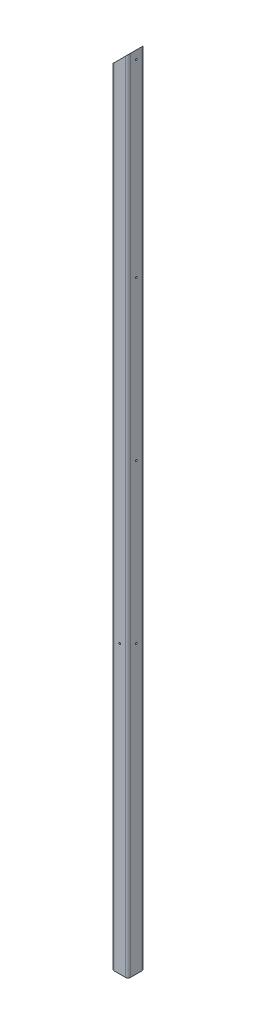
ISO-10303-21;
HEADER;
FILE_DESCRIPTION(('STEP AP214'),'2;1');
FILE_NAME('part.step','',(''),(''),'','','');
FILE_SCHEMA(('AUTOMOTIVE_DESIGN { 1 0 10303 214 1 1 1 1 }'));
ENDSEC;
DATA;
#1=APPLICATION_CONTEXT('core data for automotive mechanical design processes');
#2=APPLICATION_PROTOCOL_DEFINITION('international standard','automotive_design',2000,#1);
#3=PRODUCT_CONTEXT('',#1,'mechanical');
#4=PRODUCT('Part','Part','',(#3));
#5=PRODUCT_RELATED_PRODUCT_CATEGORY('part','',(#4));
#6=PRODUCT_DEFINITION_FORMATION('','',#4);
#7=PRODUCT_DEFINITION_CONTEXT('part definition',#1,'design');
#8=PRODUCT_DEFINITION('design','',#6,#7);
#9=PRODUCT_DEFINITION_SHAPE('','',#8);
#10=(LENGTH_UNIT() NAMED_UNIT(*) SI_UNIT(.MILLI.,.METRE.));
#11=(NAMED_UNIT(*) PLANE_ANGLE_UNIT() SI_UNIT($,.RADIAN.));
#12=(NAMED_UNIT(*) SI_UNIT($,.STERADIAN.) SOLID_ANGLE_UNIT());
#13=UNCERTAINTY_MEASURE_WITH_UNIT(LENGTH_MEASURE(1.E-05),#10,'distance_accuracy_value','');
#14=(GEOMETRIC_REPRESENTATION_CONTEXT(3) GLOBAL_UNCERTAINTY_ASSIGNED_CONTEXT((#13)) GLOBAL_UNIT_ASSIGNED_CONTEXT((#10,
#11,#12)) REPRESENTATION_CONTEXT('',''));
#15=CARTESIAN_POINT('',(0.,0.,0.));
#16=DIRECTION('',(0.,0.,1.));
#17=DIRECTION('',(1.,0.,0.));
#18=AXIS2_PLACEMENT_3D('',#15,#16,#17);
#19=CARTESIAN_POINT('',(-13.6,1920.,13.6));
#20=DIRECTION('',(0.,-1.,0.));
#21=DIRECTION('',(0.,0.,-1.));
#22=AXIS2_PLACEMENT_3D('',#19,#20,#21);
#23=CYLINDRICAL_SURFACE('',#22,6.4);
#24=CARTESIAN_POINT('',(-13.6,1886.4,13.6));
#25=DIRECTION('',(-0.707106781186548,0.707106781186547,0.));
#26=DIRECTION('',(-0.707106781186547,-0.707106781186548,0.));
#27=AXIS2_PLACEMENT_3D('',#24,#25,#26);
#28=ELLIPSE('',#27,9.05096679918782,6.4);
#29=CARTESIAN_POINT('',(-20.,1880.,13.6));
#30=VERTEX_POINT('',#29);
#31=CARTESIAN_POINT('',(-13.5999999999999,1886.4,20.));
#32=VERTEX_POINT('',#31);
#33=EDGE_CURVE('E245',#30,#32,#28,.T.);
#34=ORIENTED_EDGE('',*,*,#33,.F.);
#35=DIRECTION('',(0.,-1.,0.));
#36=VECTOR('',#35,1.);
#37=CARTESIAN_POINT('',(-20.,1920.,13.6));
#38=LINE('',#37,#36);
#39=CARTESIAN_POINT('',(-20.,0.,13.6));
#40=VERTEX_POINT('',#39);
#41=EDGE_CURVE('E161',#30,#40,#38,.T.);
#42=ORIENTED_EDGE('',*,*,#41,.T.);
#43=CARTESIAN_POINT('',(-13.6,0.,13.6));
#44=DIRECTION('',(0.,1.,0.));
#45=DIRECTION('',(0.,0.,1.));
#46=AXIS2_PLACEMENT_3D('',#43,#44,#45);
#47=CIRCLE('',#46,6.4);
#48=CARTESIAN_POINT('',(-13.6,0.,20.));
#49=VERTEX_POINT('',#48);
#50=EDGE_CURVE('E176',#40,#49,#47,.T.);
#51=ORIENTED_EDGE('',*,*,#50,.T.);
#52=DIRECTION('',(0.,-1.,0.));
#53=VECTOR('',#52,1.);
#54=CARTESIAN_POINT('',(-13.6,1920.,20.));
#55=LINE('',#54,#53);
#56=EDGE_CURVE('E12',#32,#49,#55,.T.);
#57=ORIENTED_EDGE('',*,*,#56,.F.);
#58=EDGE_LOOP('',(#34,#42,#51,#57));
#59=FACE_BOUND('',#58,.T.);
#60=ADVANCED_FACE('F66',(#59),#23,.T.);
#61=CARTESIAN_POINT('',(-13.6,1920.,20.));
#62=DIRECTION('',(0.,0.,-1.));
#63=DIRECTION('',(-1.,0.,0.));
#64=AXIS2_PLACEMENT_3D('',#61,#62,#63);
#65=PLANE('',#64);
#66=CARTESIAN_POINT('',(0.,687.,20.));
#67=DIRECTION('',(0.,0.,1.));
#68=DIRECTION('',(1.,0.,0.));
#69=AXIS2_PLACEMENT_3D('',#66,#67,#68);
#70=CIRCLE('',#69,2.);
#71=CARTESIAN_POINT('',(2.,687.,20.));
#72=VERTEX_POINT('',#71);
#73=EDGE_CURVE('E491',#72,#72,#70,.T.);
#74=ORIENTED_EDGE('',*,*,#73,.F.);
#75=EDGE_LOOP('',(#74));
#76=FACE_BOUND('',#75,.T.);
#77=DIRECTION('',(0.707106781186547,0.707106781186548,0.));
#78=VECTOR('',#77,1.);
#79=CARTESIAN_POINT('',(-950.,950.,20.));
#80=LINE('',#79,#78);
#81=CARTESIAN_POINT('',(13.6,1913.6,20.));
#82=VERTEX_POINT('',#81);
#83=EDGE_CURVE('E350',#32,#82,#80,.T.);
#84=ORIENTED_EDGE('',*,*,#83,.F.);
#85=ORIENTED_EDGE('',*,*,#56,.T.);
#86=DIRECTION('',(1.,0.,0.));
#87=VECTOR('',#86,1.);
#88=CARTESIAN_POINT('',(-13.6,0.,20.));
#89=LINE('',#88,#87);
#90=CARTESIAN_POINT('',(13.6,0.,20.));
#91=VERTEX_POINT('',#90);
#92=EDGE_CURVE('E274',#49,#91,#89,.T.);
#93=ORIENTED_EDGE('',*,*,#92,.T.);
#94=DIRECTION('',(0.,-1.,0.));
#95=VECTOR('',#94,1.);
#96=CARTESIAN_POINT('',(13.6,1920.,20.));
#97=LINE('',#96,#95);
#98=EDGE_CURVE('E76',#82,#91,#97,.T.);
#99=ORIENTED_EDGE('',*,*,#98,.F.);
#100=EDGE_LOOP('',(#84,#85,#93,#99));
#101=FACE_BOUND('',#100,.T.);
#102=ADVANCED_FACE('F356',(#76,#101),#65,.F.);
#103=CARTESIAN_POINT('',(13.6,1920.,13.6));
#104=DIRECTION('',(0.,-1.,0.));
#105=DIRECTION('',(0.,0.,-1.));
#106=AXIS2_PLACEMENT_3D('',#103,#104,#105);
#107=CYLINDRICAL_SURFACE('',#106,6.4);
#108=CARTESIAN_POINT('',(13.6,1913.6,13.6));
#109=DIRECTION('',(-0.707106781186548,0.707106781186547,0.));
#110=DIRECTION('',(-0.707106781186547,-0.707106781186548,0.));
#111=AXIS2_PLACEMENT_3D('',#108,#109,#110);
#112=ELLIPSE('',#111,9.05096679918782,6.4);
#113=CARTESIAN_POINT('',(20.,1920.,13.6));
#114=VERTEX_POINT('',#113);
#115=EDGE_CURVE('E93',#82,#114,#112,.T.);
#116=ORIENTED_EDGE('',*,*,#115,.F.);
#117=ORIENTED_EDGE('',*,*,#98,.T.);
#118=CARTESIAN_POINT('',(13.6,0.,13.6));
#119=DIRECTION('',(0.,1.,0.));
#120=DIRECTION('',(0.,0.,1.));
#121=AXIS2_PLACEMENT_3D('',#118,#119,#120);
#122=CIRCLE('',#121,6.4);
#123=CARTESIAN_POINT('',(20.,0.,13.6));
#124=VERTEX_POINT('',#123);
#125=EDGE_CURVE('E278',#91,#124,#122,.T.);
#126=ORIENTED_EDGE('',*,*,#125,.T.);
#127=DIRECTION('',(0.,-1.,0.));
#128=VECTOR('',#127,1.);
#129=CARTESIAN_POINT('',(20.,1920.,13.6));
#130=LINE('',#129,#128);
#131=EDGE_CURVE('E196',#114,#124,#130,.T.);
#132=ORIENTED_EDGE('',*,*,#131,.F.);
#133=EDGE_LOOP('',(#116,#117,#126,#132));
#134=FACE_BOUND('',#133,.T.);
#135=ADVANCED_FACE('F425',(#134),#107,.T.);
#136=CARTESIAN_POINT('',(13.6,1920.,-13.6));
#137=DIRECTION('',(0.,-1.,0.));
#138=DIRECTION('',(0.,0.,-1.));
#139=AXIS2_PLACEMENT_3D('',#136,#137,#138);
#140=CYLINDRICAL_SURFACE('',#139,6.4);
#141=CARTESIAN_POINT('',(13.6,1913.6,-13.6));
#142=DIRECTION('',(-0.707106781186548,0.707106781186547,0.));
#143=DIRECTION('',(-0.707106781186547,-0.707106781186548,0.));
#144=AXIS2_PLACEMENT_3D('',#141,#142,#143);
#145=ELLIPSE('',#144,9.05096679918781,6.4);
#146=CARTESIAN_POINT('',(20.,1920.,-13.6));
#147=VERTEX_POINT('',#146);
#148=CARTESIAN_POINT('',(13.6000000000003,1913.6,-20.));
#149=VERTEX_POINT('',#148);
#150=EDGE_CURVE('E303',#147,#149,#145,.T.);
#151=ORIENTED_EDGE('',*,*,#150,.F.);
#152=DIRECTION('',(0.,-1.,0.));
#153=VECTOR('',#152,1.);
#154=CARTESIAN_POINT('',(20.,1920.,-13.6));
#155=LINE('',#154,#153);
#156=CARTESIAN_POINT('',(20.,0.,-13.6));
#157=VERTEX_POINT('',#156);
#158=EDGE_CURVE('E192',#147,#157,#155,.T.);
#159=ORIENTED_EDGE('',*,*,#158,.T.);
#160=CARTESIAN_POINT('',(13.6,0.,-13.6));
#161=DIRECTION('',(0.,1.,0.));
#162=DIRECTION('',(0.,0.,1.));
#163=AXIS2_PLACEMENT_3D('',#160,#161,#162);
#164=CIRCLE('',#163,6.4);
#165=CARTESIAN_POINT('',(13.6,0.,-20.));
#166=VERTEX_POINT('',#165);
#167=EDGE_CURVE('E284',#157,#166,#164,.T.);
#168=ORIENTED_EDGE('',*,*,#167,.T.);
#169=DIRECTION('',(0.,-1.,0.));
#170=VECTOR('',#169,1.);
#171=CARTESIAN_POINT('',(13.6,1920.,-20.));
#172=LINE('',#171,#170);
#173=EDGE_CURVE('E189',#149,#166,#172,.T.);
#174=ORIENTED_EDGE('',*,*,#173,.F.);
#175=EDGE_LOOP('',(#151,#159,#168,#174));
#176=FACE_BOUND('',#175,.T.);
#177=ADVANCED_FACE('F298',(#176),#140,.T.);
#178=CARTESIAN_POINT('',(13.6,1920.,-20.));
#179=DIRECTION('',(0.,0.,1.));
#180=DIRECTION('',(1.,0.,0.));
#181=AXIS2_PLACEMENT_3D('',#178,#179,#180);
#182=PLANE('',#181);
#183=DIRECTION('',(0.707106781186547,0.707106781186548,0.));
#184=VECTOR('',#183,1.);
#185=CARTESIAN_POINT('',(-950.,950.,-20.));
#186=LINE('',#185,#184);
#187=CARTESIAN_POINT('',(-13.6,1886.4,-20.));
#188=VERTEX_POINT('',#187);
#189=EDGE_CURVE('E358',#188,#149,#186,.T.);
#190=ORIENTED_EDGE('',*,*,#189,.T.);
#191=ORIENTED_EDGE('',*,*,#173,.T.);
#192=DIRECTION('',(-1.,0.,0.));
#193=VECTOR('',#192,1.);
#194=CARTESIAN_POINT('',(13.6,0.,-20.));
#195=LINE('',#194,#193);
#196=CARTESIAN_POINT('',(-13.6,0.,-20.));
#197=VERTEX_POINT('',#196);
#198=EDGE_CURVE('E171',#166,#197,#195,.T.);
#199=ORIENTED_EDGE('',*,*,#198,.T.);
#200=DIRECTION('',(0.,-1.,0.));
#201=VECTOR('',#200,1.);
#202=CARTESIAN_POINT('',(-13.6,1920.,-20.));
#203=LINE('',#202,#201);
#204=EDGE_CURVE('E160',#188,#197,#203,.T.);
#205=ORIENTED_EDGE('',*,*,#204,.F.);
#206=EDGE_LOOP('',(#190,#191,#199,#205));
#207=FACE_BOUND('',#206,.T.);
#208=ADVANCED_FACE('F290',(#207),#182,.F.);
#209=CARTESIAN_POINT('',(-13.6,1920.,-13.6));
#210=DIRECTION('',(0.,-1.,0.));
#211=DIRECTION('',(0.,0.,-1.));
#212=AXIS2_PLACEMENT_3D('',#209,#210,#211);
#213=CYLINDRICAL_SURFACE('',#212,6.4);
#214=CARTESIAN_POINT('',(-13.6,1886.4,-13.6));
#215=DIRECTION('',(-0.707106781186548,0.707106781186547,0.));
#216=DIRECTION('',(-0.707106781186547,-0.707106781186548,0.));
#217=AXIS2_PLACEMENT_3D('',#214,#215,#216);
#218=ELLIPSE('',#217,9.05096679918782,6.4);
#219=CARTESIAN_POINT('',(-20.,1880.,-13.6));
#220=VERTEX_POINT('',#219);
#221=EDGE_CURVE('E331',#188,#220,#218,.T.);
#222=ORIENTED_EDGE('',*,*,#221,.F.);
#223=ORIENTED_EDGE('',*,*,#204,.T.);
#224=CARTESIAN_POINT('',(-13.6,0.,-13.6));
#225=DIRECTION('',(0.,1.,0.));
#226=DIRECTION('',(0.,0.,1.));
#227=AXIS2_PLACEMENT_3D('',#224,#225,#226);
#228=CIRCLE('',#227,6.4);
#229=CARTESIAN_POINT('',(-20.,0.,-13.6));
#230=VERTEX_POINT('',#229);
#231=EDGE_CURVE('E164',#197,#230,#228,.T.);
#232=ORIENTED_EDGE('',*,*,#231,.T.);
#233=DIRECTION('',(0.,-1.,0.));
#234=VECTOR('',#233,1.);
#235=CARTESIAN_POINT('',(-20.,1920.,-13.6));
#236=LINE('',#235,#234);
#237=EDGE_CURVE('E147',#220,#230,#236,.T.);
#238=ORIENTED_EDGE('',*,*,#237,.F.);
#239=EDGE_LOOP('',(#222,#223,#232,#238));
#240=FACE_BOUND('',#239,.T.);
#241=ADVANCED_FACE('F165',(#240),#213,.T.);
#242=CARTESIAN_POINT('',(13.6,1920.,13.6));
#243=DIRECTION('',(0.,-1.,0.));
#244=DIRECTION('',(0.,0.,-1.));
#245=AXIS2_PLACEMENT_3D('',#242,#243,#244);
#246=CYLINDRICAL_SURFACE('',#245,3.2);
#247=DIRECTION('',(0.,-1.,0.));
#248=VECTOR('',#247,1.);
#249=CARTESIAN_POINT('',(13.6,1920.,16.8));
#250=LINE('',#249,#248);
#251=CARTESIAN_POINT('',(13.6,1913.6,16.8));
#252=VERTEX_POINT('',#251);
#253=CARTESIAN_POINT('',(13.6,0.,16.8));
#254=VERTEX_POINT('',#253);
#255=EDGE_CURVE('E70',#252,#254,#250,.T.);
#256=ORIENTED_EDGE('',*,*,#255,.F.);
#257=CARTESIAN_POINT('',(13.6,1913.6,13.6));
#258=DIRECTION('',(-0.707106781186548,0.707106781186547,0.));
#259=DIRECTION('',(-0.707106781186547,-0.707106781186548,0.));
#260=AXIS2_PLACEMENT_3D('',#257,#258,#259);
#261=ELLIPSE('',#260,4.52548339959391,3.2);
#262=CARTESIAN_POINT('',(16.8,1916.8,13.6));
#263=VERTEX_POINT('',#262);
#264=EDGE_CURVE('E327',#252,#263,#261,.T.);
#265=ORIENTED_EDGE('',*,*,#264,.T.);
#266=DIRECTION('',(0.,-1.,0.));
#267=VECTOR('',#266,1.);
#268=CARTESIAN_POINT('',(16.8,1920.,13.6));
#269=LINE('',#268,#267);
#270=CARTESIAN_POINT('',(16.8,0.,13.6));
#271=VERTEX_POINT('',#270);
#272=EDGE_CURVE('E181',#263,#271,#269,.T.);
#273=ORIENTED_EDGE('',*,*,#272,.T.);
#274=CARTESIAN_POINT('',(13.6,0.,13.6));
#275=DIRECTION('',(0.,1.,0.));
#276=DIRECTION('',(0.,0.,1.));
#277=AXIS2_PLACEMENT_3D('',#274,#275,#276);
#278=CIRCLE('',#277,3.2);
#279=EDGE_CURVE('E239',#254,#271,#278,.T.);
#280=ORIENTED_EDGE('',*,*,#279,.F.);
#281=EDGE_LOOP('',(#256,#265,#273,#280));
#282=FACE_BOUND('',#281,.T.);
#283=ADVANCED_FACE('F68',(#282),#246,.F.);
#284=CARTESIAN_POINT('',(-13.6,1920.,16.8));
#285=DIRECTION('',(0.,0.,-1.));
#286=DIRECTION('',(-1.,0.,0.));
#287=AXIS2_PLACEMENT_3D('',#284,#285,#286);
#288=PLANE('',#287);
#289=DIRECTION('',(0.,-1.,0.));
#290=VECTOR('',#289,1.);
#291=CARTESIAN_POINT('',(-13.6,1920.,16.8));
#292=LINE('',#291,#290);
#293=CARTESIAN_POINT('',(-13.6,1886.4,16.8));
#294=VERTEX_POINT('',#293);
#295=CARTESIAN_POINT('',(-13.6,0.,16.8));
#296=VERTEX_POINT('',#295);
#297=EDGE_CURVE('E218',#294,#296,#292,.T.);
#298=ORIENTED_EDGE('',*,*,#297,.F.);
#299=DIRECTION('',(0.707106781186547,0.707106781186548,0.));
#300=VECTOR('',#299,1.);
#301=CARTESIAN_POINT('',(3.19999999999985,1903.2,16.8));
#302=LINE('',#301,#300);
#303=EDGE_CURVE('E235',#294,#252,#302,.T.);
#304=ORIENTED_EDGE('',*,*,#303,.T.);
#305=ORIENTED_EDGE('',*,*,#255,.T.);
#306=DIRECTION('',(1.,0.,0.));
#307=VECTOR('',#306,1.);
#308=CARTESIAN_POINT('',(-13.6,0.,16.8));
#309=LINE('',#308,#307);
#310=EDGE_CURVE('E232',#296,#254,#309,.T.);
#311=ORIENTED_EDGE('',*,*,#310,.F.);
#312=EDGE_LOOP('',(#298,#304,#305,#311));
#313=FACE_BOUND('',#312,.T.);
#314=ADVANCED_FACE('F230',(#313),#288,.T.);
#315=CARTESIAN_POINT('',(-13.6,1920.,13.6));
#316=DIRECTION('',(0.,-1.,0.));
#317=DIRECTION('',(0.,0.,-1.));
#318=AXIS2_PLACEMENT_3D('',#315,#316,#317);
#319=CYLINDRICAL_SURFACE('',#318,3.2);
#320=DIRECTION('',(0.,-1.,0.));
#321=VECTOR('',#320,1.);
#322=CARTESIAN_POINT('',(-16.8,1920.,13.6));
#323=LINE('',#322,#321);
#324=CARTESIAN_POINT('',(-16.8,1883.2,13.6));
#325=VERTEX_POINT('',#324);
#326=CARTESIAN_POINT('',(-16.8,0.,13.6));
#327=VERTEX_POINT('',#326);
#328=EDGE_CURVE('E216',#325,#327,#323,.T.);
#329=ORIENTED_EDGE('',*,*,#328,.F.);
#330=CARTESIAN_POINT('',(-13.6,1886.4,13.6));
#331=DIRECTION('',(-0.707106781186548,0.707106781186547,0.));
#332=DIRECTION('',(-0.707106781186547,-0.707106781186548,0.));
#333=AXIS2_PLACEMENT_3D('',#330,#331,#332);
#334=ELLIPSE('',#333,4.5254833995939,3.2);
#335=EDGE_CURVE('E336',#325,#294,#334,.T.);
#336=ORIENTED_EDGE('',*,*,#335,.T.);
#337=ORIENTED_EDGE('',*,*,#297,.T.);
#338=CARTESIAN_POINT('',(-13.6,0.,13.6));
#339=DIRECTION('',(0.,1.,0.));
#340=DIRECTION('',(0.,0.,1.));
#341=AXIS2_PLACEMENT_3D('',#338,#339,#340);
#342=CIRCLE('',#341,3.2);
#343=EDGE_CURVE('E248',#327,#296,#342,.T.);
#344=ORIENTED_EDGE('',*,*,#343,.F.);
#345=EDGE_LOOP('',(#329,#336,#337,#344));
#346=FACE_BOUND('',#345,.T.);
#347=ADVANCED_FACE('F392',(#346),#319,.F.);
#348=CARTESIAN_POINT('',(-16.8,1920.,13.6));
#349=DIRECTION('',(1.,0.,0.));
#350=DIRECTION('',(0.,0.,-1.));
#351=AXIS2_PLACEMENT_3D('',#348,#349,#350);
#352=PLANE('',#351);
#353=DIRECTION('',(0.,-1.,0.));
#354=VECTOR('',#353,1.);
#355=CARTESIAN_POINT('',(-16.8,1920.,-13.6));
#356=LINE('',#355,#354);
#357=CARTESIAN_POINT('',(-16.8,1883.2,-13.6));
#358=VERTEX_POINT('',#357);
#359=CARTESIAN_POINT('',(-16.8,0.,-13.6));
#360=VERTEX_POINT('',#359);
#361=EDGE_CURVE('E213',#358,#360,#356,.T.);
#362=ORIENTED_EDGE('',*,*,#361,.F.);
#363=DIRECTION('',(0.,0.,1.));
#364=VECTOR('',#363,1.);
#365=CARTESIAN_POINT('',(-16.8,1883.2,13.6));
#366=LINE('',#365,#364);
#367=EDGE_CURVE('E387',#358,#325,#366,.T.);
#368=ORIENTED_EDGE('',*,*,#367,.T.);
#369=ORIENTED_EDGE('',*,*,#328,.T.);
#370=DIRECTION('',(0.,0.,1.));
#371=VECTOR('',#370,1.);
#372=CARTESIAN_POINT('',(-16.8,0.,13.6));
#373=LINE('',#372,#371);
#374=EDGE_CURVE('E252',#360,#327,#373,.T.);
#375=ORIENTED_EDGE('',*,*,#374,.F.);
#376=EDGE_LOOP('',(#362,#368,#369,#375));
#377=FACE_BOUND('',#376,.T.);
#378=ADVANCED_FACE('F395',(#377),#352,.T.);
#379=CARTESIAN_POINT('',(-13.6,1920.,-13.6));
#380=DIRECTION('',(0.,-1.,0.));
#381=DIRECTION('',(0.,0.,-1.));
#382=AXIS2_PLACEMENT_3D('',#379,#380,#381);
#383=CYLINDRICAL_SURFACE('',#382,3.2);
#384=DIRECTION('',(0.,-1.,0.));
#385=VECTOR('',#384,1.);
#386=CARTESIAN_POINT('',(-13.6,1920.,-16.8));
#387=LINE('',#386,#385);
#388=CARTESIAN_POINT('',(-13.6,1886.4,-16.8));
#389=VERTEX_POINT('',#388);
#390=CARTESIAN_POINT('',(-13.6,0.,-16.8));
#391=VERTEX_POINT('',#390);
#392=EDGE_CURVE('E210',#389,#391,#387,.T.);
#393=ORIENTED_EDGE('',*,*,#392,.F.);
#394=CARTESIAN_POINT('',(-13.6,1886.4,-13.6));
#395=DIRECTION('',(-0.707106781186548,0.707106781186547,0.));
#396=DIRECTION('',(-0.707106781186547,-0.707106781186548,0.));
#397=AXIS2_PLACEMENT_3D('',#394,#395,#396);
#398=ELLIPSE('',#397,4.5254833995939,3.2);
#399=EDGE_CURVE('E383',#389,#358,#398,.T.);
#400=ORIENTED_EDGE('',*,*,#399,.T.);
#401=ORIENTED_EDGE('',*,*,#361,.T.);
#402=CARTESIAN_POINT('',(-13.6,0.,-13.6));
#403=DIRECTION('',(0.,1.,0.));
#404=DIRECTION('',(0.,0.,1.));
#405=AXIS2_PLACEMENT_3D('',#402,#403,#404);
#406=CIRCLE('',#405,3.2);
#407=EDGE_CURVE('E257',#391,#360,#406,.T.);
#408=ORIENTED_EDGE('',*,*,#407,.F.);
#409=EDGE_LOOP('',(#393,#400,#401,#408));
#410=FACE_BOUND('',#409,.T.);
#411=ADVANCED_FACE('F400',(#410),#383,.F.);
#412=CARTESIAN_POINT('',(13.6,1920.,-16.8));
#413=DIRECTION('',(0.,0.,1.));
#414=DIRECTION('',(1.,0.,0.));
#415=AXIS2_PLACEMENT_3D('',#412,#413,#414);
#416=PLANE('',#415);
#417=DIRECTION('',(0.,-1.,0.));
#418=VECTOR('',#417,1.);
#419=CARTESIAN_POINT('',(13.6,1920.,-16.8));
#420=LINE('',#419,#418);
#421=CARTESIAN_POINT('',(13.6,1913.6,-16.8));
#422=VERTEX_POINT('',#421);
#423=CARTESIAN_POINT('',(13.6,0.,-16.8));
#424=VERTEX_POINT('',#423);
#425=EDGE_CURVE('E207',#422,#424,#420,.T.);
#426=ORIENTED_EDGE('',*,*,#425,.F.);
#427=DIRECTION('',(-0.707106781186547,-0.707106781186548,0.));
#428=VECTOR('',#427,1.);
#429=CARTESIAN_POINT('',(16.7999999999999,1916.8,-16.8));
#430=LINE('',#429,#428);
#431=EDGE_CURVE('E379',#422,#389,#430,.T.);
#432=ORIENTED_EDGE('',*,*,#431,.T.);
#433=ORIENTED_EDGE('',*,*,#392,.T.);
#434=DIRECTION('',(-1.,0.,0.));
#435=VECTOR('',#434,1.);
#436=CARTESIAN_POINT('',(13.6,0.,-16.8));
#437=LINE('',#436,#435);
#438=EDGE_CURVE('E261',#424,#391,#437,.T.);
#439=ORIENTED_EDGE('',*,*,#438,.F.);
#440=EDGE_LOOP('',(#426,#432,#433,#439));
#441=FACE_BOUND('',#440,.T.);
#442=ADVANCED_FACE('F403',(#441),#416,.T.);
#443=CARTESIAN_POINT('',(13.6,1920.,-13.6));
#444=DIRECTION('',(0.,-1.,0.));
#445=DIRECTION('',(0.,0.,-1.));
#446=AXIS2_PLACEMENT_3D('',#443,#444,#445);
#447=CYLINDRICAL_SURFACE('',#446,3.2);
#448=DIRECTION('',(0.,-1.,0.));
#449=VECTOR('',#448,1.);
#450=CARTESIAN_POINT('',(16.8,1920.,-13.6));
#451=LINE('',#450,#449);
#452=CARTESIAN_POINT('',(16.8,1916.8,-13.6));
#453=VERTEX_POINT('',#452);
#454=CARTESIAN_POINT('',(16.8,0.,-13.6));
#455=VERTEX_POINT('',#454);
#456=EDGE_CURVE('E204',#453,#455,#451,.T.);
#457=ORIENTED_EDGE('',*,*,#456,.F.);
#458=CARTESIAN_POINT('',(13.6,1913.6,-13.6));
#459=DIRECTION('',(-0.707106781186548,0.707106781186547,0.));
#460=DIRECTION('',(-0.707106781186547,-0.707106781186548,0.));
#461=AXIS2_PLACEMENT_3D('',#458,#459,#460);
#462=ELLIPSE('',#461,4.5254833995939,3.2);
#463=EDGE_CURVE('E84',#453,#422,#462,.T.);
#464=ORIENTED_EDGE('',*,*,#463,.T.);
#465=ORIENTED_EDGE('',*,*,#425,.T.);
#466=CARTESIAN_POINT('',(13.6,0.,-13.6));
#467=DIRECTION('',(0.,1.,0.));
#468=DIRECTION('',(0.,0.,1.));
#469=AXIS2_PLACEMENT_3D('',#466,#467,#468);
#470=CIRCLE('',#469,3.2);
#471=EDGE_CURVE('E265',#455,#424,#470,.T.);
#472=ORIENTED_EDGE('',*,*,#471,.F.);
#473=EDGE_LOOP('',(#457,#464,#465,#472));
#474=FACE_BOUND('',#473,.T.);
#475=ADVANCED_FACE('F408',(#474),#447,.F.);
#476=CARTESIAN_POINT('',(16.8,1920.,-13.6));
#477=DIRECTION('',(-1.,0.,0.));
#478=DIRECTION('',(0.,0.,1.));
#479=AXIS2_PLACEMENT_3D('',#476,#477,#478);
#480=PLANE('',#479);
#481=ORIENTED_EDGE('',*,*,#272,.F.);
#482=DIRECTION('',(0.,0.,-1.));
#483=VECTOR('',#482,1.);
#484=CARTESIAN_POINT('',(16.8,1916.8,-13.6));
#485=LINE('',#484,#483);
#486=EDGE_CURVE('E329',#263,#453,#485,.T.);
#487=ORIENTED_EDGE('',*,*,#486,.T.);
#488=ORIENTED_EDGE('',*,*,#456,.T.);
#489=DIRECTION('',(0.,0.,-1.));
#490=VECTOR('',#489,1.);
#491=CARTESIAN_POINT('',(16.8,0.,-13.6));
#492=LINE('',#491,#490);
#493=EDGE_CURVE('E269',#271,#455,#492,.T.);
#494=ORIENTED_EDGE('',*,*,#493,.F.);
#495=EDGE_LOOP('',(#481,#487,#488,#494));
#496=FACE_BOUND('',#495,.T.);
#497=ADVANCED_FACE('F410',(#496),#480,.T.);
#498=CARTESIAN_POINT('',(-20.,1920.,13.6));
#499=DIRECTION('',(1.,0.,0.));
#500=DIRECTION('',(0.,0.,-1.));
#501=AXIS2_PLACEMENT_3D('',#498,#499,#500);
#502=PLANE('',#501);
#503=DIRECTION('',(0.,0.,-1.));
#504=VECTOR('',#503,1.);
#505=CARTESIAN_POINT('',(-20.,1880.,20.));
#506=LINE('',#505,#504);
#507=EDGE_CURVE('E156',#30,#220,#506,.T.);
#508=ORIENTED_EDGE('',*,*,#507,.T.);
#509=ORIENTED_EDGE('',*,*,#237,.T.);
#510=DIRECTION('',(0.,0.,1.));
#511=VECTOR('',#510,1.);
#512=CARTESIAN_POINT('',(-20.,0.,13.6));
#513=LINE('',#512,#511);
#514=EDGE_CURVE('E152',#230,#40,#513,.T.);
#515=ORIENTED_EDGE('',*,*,#514,.T.);
#516=ORIENTED_EDGE('',*,*,#41,.F.);
#517=EDGE_LOOP('',(#508,#509,#515,#516));
#518=FACE_BOUND('',#517,.T.);
#519=ADVANCED_FACE('F149',(#518),#502,.F.);
#520=CARTESIAN_POINT('',(20.,1920.,-13.6));
#521=DIRECTION('',(-1.,0.,0.));
#522=DIRECTION('',(0.,0.,1.));
#523=AXIS2_PLACEMENT_3D('',#520,#521,#522);
#524=PLANE('',#523);
#525=CARTESIAN_POINT('',(20.,1900.,0.));
#526=DIRECTION('',(1.,0.,0.));
#527=DIRECTION('',(0.,0.,-1.));
#528=AXIS2_PLACEMENT_3D('',#525,#526,#527);
#529=CIRCLE('',#528,2.);
#530=CARTESIAN_POINT('',(20.,1900.,-2.00000000000001));
#531=VERTEX_POINT('',#530);
#532=EDGE_CURVE('E369',#531,#531,#529,.T.);
#533=ORIENTED_EDGE('',*,*,#532,.F.);
#534=EDGE_LOOP('',(#533));
#535=FACE_BOUND('',#534,.T.);
#536=CARTESIAN_POINT('',(20.,1447.,0.));
#537=DIRECTION('',(1.,0.,0.));
#538=DIRECTION('',(0.,0.,-1.));
#539=AXIS2_PLACEMENT_3D('',#536,#537,#538);
#540=CIRCLE('',#539,2.);
#541=CARTESIAN_POINT('',(20.,1447.,-2.00000000000007));
#542=VERTEX_POINT('',#541);
#543=EDGE_CURVE('E507',#542,#542,#540,.T.);
#544=ORIENTED_EDGE('',*,*,#543,.F.);
#545=EDGE_LOOP('',(#544));
#546=FACE_BOUND('',#545,.T.);
#547=CARTESIAN_POINT('',(20.,1067.,-1.10920259905105E-13));
#548=DIRECTION('',(1.,0.,0.));
#549=DIRECTION('',(0.,0.,-1.));
#550=AXIS2_PLACEMENT_3D('',#547,#548,#549);
#551=CIRCLE('',#550,2.);
#552=CARTESIAN_POINT('',(20.,1067.,-2.00000000000011));
#553=VERTEX_POINT('',#552);
#554=EDGE_CURVE('E515',#553,#553,#551,.T.);
#555=ORIENTED_EDGE('',*,*,#554,.F.);
#556=EDGE_LOOP('',(#555));
#557=FACE_BOUND('',#556,.T.);
#558=CARTESIAN_POINT('',(20.,687.,-1.57757793756479E-13));
#559=DIRECTION('',(1.,0.,0.));
#560=DIRECTION('',(0.,0.,-1.));
#561=AXIS2_PLACEMENT_3D('',#558,#559,#560);
#562=CIRCLE('',#561,2.);
#563=CARTESIAN_POINT('',(20.,687.,-2.00000000000016));
#564=VERTEX_POINT('',#563);
#565=EDGE_CURVE('E490',#564,#564,#562,.T.);
#566=ORIENTED_EDGE('',*,*,#565,.F.);
#567=EDGE_LOOP('',(#566));
#568=FACE_BOUND('',#567,.T.);
#569=DIRECTION('',(0.,0.,-1.));
#570=VECTOR('',#569,1.);
#571=CARTESIAN_POINT('',(20.,0.,-13.6));
#572=LINE('',#571,#570);
#573=EDGE_CURVE('E281',#124,#157,#572,.T.);
#574=ORIENTED_EDGE('',*,*,#573,.T.);
#575=ORIENTED_EDGE('',*,*,#158,.F.);
#576=DIRECTION('',(0.,0.,-1.));
#577=VECTOR('',#576,1.);
#578=CARTESIAN_POINT('',(20.,1920.,-13.6));
#579=LINE('',#578,#577);
#580=EDGE_CURVE('E178',#114,#147,#579,.T.);
#581=ORIENTED_EDGE('',*,*,#580,.F.);
#582=ORIENTED_EDGE('',*,*,#131,.T.);
#583=EDGE_LOOP('',(#574,#575,#581,#582));
#584=FACE_BOUND('',#583,.T.);
#585=ADVANCED_FACE('F306',(#535,#546,#557,#568,#584),#524,.F.);
#586=CARTESIAN_POINT('',(-13.6,0.,13.6));
#587=DIRECTION('',(0.,1.,0.));
#588=DIRECTION('',(0.,0.,1.));
#589=AXIS2_PLACEMENT_3D('',#586,#587,#588);
#590=PLANE('',#589);
#591=ORIENTED_EDGE('',*,*,#279,.T.);
#592=ORIENTED_EDGE('',*,*,#493,.T.);
#593=ORIENTED_EDGE('',*,*,#471,.T.);
#594=ORIENTED_EDGE('',*,*,#438,.T.);
#595=ORIENTED_EDGE('',*,*,#407,.T.);
#596=ORIENTED_EDGE('',*,*,#374,.T.);
#597=ORIENTED_EDGE('',*,*,#343,.T.);
#598=ORIENTED_EDGE('',*,*,#310,.T.);
#599=EDGE_LOOP('',(#591,#592,#593,#594,#595,#596,#597,#598));
#600=FACE_BOUND('',#599,.T.);
#601=ORIENTED_EDGE('',*,*,#50,.F.);
#602=ORIENTED_EDGE('',*,*,#514,.F.);
#603=ORIENTED_EDGE('',*,*,#231,.F.);
#604=ORIENTED_EDGE('',*,*,#198,.F.);
#605=ORIENTED_EDGE('',*,*,#167,.F.);
#606=ORIENTED_EDGE('',*,*,#573,.F.);
#607=ORIENTED_EDGE('',*,*,#125,.F.);
#608=ORIENTED_EDGE('',*,*,#92,.F.);
#609=EDGE_LOOP('',(#601,#602,#603,#604,#605,#606,#607,#608));
#610=FACE_BOUND('',#609,.T.);
#611=ADVANCED_FACE('F173',(#600,#610),#590,.F.);
#612=CARTESIAN_POINT('',(-950.,950.,20.));
#613=DIRECTION('',(-0.707106781186548,0.707106781186547,0.));
#614=DIRECTION('',(-0.707106781186547,-0.707106781186548,0.));
#615=AXIS2_PLACEMENT_3D('',#612,#613,#614);
#616=PLANE('',#615);
#617=ORIENTED_EDGE('',*,*,#303,.F.);
#618=ORIENTED_EDGE('',*,*,#335,.F.);
#619=ORIENTED_EDGE('',*,*,#367,.F.);
#620=ORIENTED_EDGE('',*,*,#399,.F.);
#621=ORIENTED_EDGE('',*,*,#431,.F.);
#622=ORIENTED_EDGE('',*,*,#463,.F.);
#623=ORIENTED_EDGE('',*,*,#486,.F.);
#624=ORIENTED_EDGE('',*,*,#264,.F.);
#625=EDGE_LOOP('',(#617,#618,#619,#620,#621,#622,#623,#624));
#626=FACE_BOUND('',#625,.T.);
#627=ORIENTED_EDGE('',*,*,#33,.T.);
#628=ORIENTED_EDGE('',*,*,#83,.T.);
#629=ORIENTED_EDGE('',*,*,#115,.T.);
#630=ORIENTED_EDGE('',*,*,#580,.T.);
#631=ORIENTED_EDGE('',*,*,#150,.T.);
#632=ORIENTED_EDGE('',*,*,#189,.F.);
#633=ORIENTED_EDGE('',*,*,#221,.T.);
#634=ORIENTED_EDGE('',*,*,#507,.F.);
#635=EDGE_LOOP('',(#627,#628,#629,#630,#631,#632,#633,#634));
#636=FACE_BOUND('',#635,.T.);
#637=ADVANCED_FACE('F328',(#626,#636),#616,.T.);
#638=CARTESIAN_POINT('',(17.,687.,-1.56992474575901E-13));
#639=DIRECTION('',(1.,0.,0.));
#640=DIRECTION('',(0.,0.,-1.));
#641=AXIS2_PLACEMENT_3D('',#638,#639,#640);
#642=CYLINDRICAL_SURFACE('',#641,2.);
#643=CARTESIAN_POINT('',(17.,687.,-1.56992474575901E-13));
#644=DIRECTION('',(1.,0.,0.));
#645=DIRECTION('',(0.,0.,-1.));
#646=AXIS2_PLACEMENT_3D('',#643,#644,#645);
#647=CIRCLE('',#646,2.);
#648=CARTESIAN_POINT('',(17.,687.,-2.00000000000016));
#649=VERTEX_POINT('',#648);
#650=EDGE_CURVE('E496',#649,#649,#647,.T.);
#651=ORIENTED_EDGE('',*,*,#650,.F.);
#652=EDGE_LOOP('',(#651));
#653=FACE_BOUND('',#652,.T.);
#654=ORIENTED_EDGE('',*,*,#565,.T.);
#655=EDGE_LOOP('',(#654));
#656=FACE_BOUND('',#655,.T.);
#657=ADVANCED_FACE('F445',(#653,#656),#642,.F.);
#658=CARTESIAN_POINT('',(17.,687.,-1.56992474575901E-13));
#659=DIRECTION('',(1.,0.,0.));
#660=DIRECTION('',(0.,0.,-1.));
#661=AXIS2_PLACEMENT_3D('',#658,#659,#660);
#662=PLANE('',#661);
#663=ORIENTED_EDGE('',*,*,#650,.T.);
#664=EDGE_LOOP('',(#663));
#665=FACE_BOUND('',#664,.T.);
#666=ADVANCED_FACE('F448',(#665),#662,.T.);
#667=CARTESIAN_POINT('',(17.,1067.,-1.10154940724527E-13));
#668=DIRECTION('',(1.,0.,0.));
#669=DIRECTION('',(0.,0.,-1.));
#670=AXIS2_PLACEMENT_3D('',#667,#668,#669);
#671=CYLINDRICAL_SURFACE('',#670,2.);
#672=CARTESIAN_POINT('',(17.,1067.,-1.10154940724527E-13));
#673=DIRECTION('',(1.,0.,0.));
#674=DIRECTION('',(0.,0.,-1.));
#675=AXIS2_PLACEMENT_3D('',#672,#673,#674);
#676=CIRCLE('',#675,2.);
#677=CARTESIAN_POINT('',(17.,1067.,-2.00000000000011));
#678=VERTEX_POINT('',#677);
#679=EDGE_CURVE('E511',#678,#678,#676,.T.);
#680=ORIENTED_EDGE('',*,*,#679,.F.);
#681=EDGE_LOOP('',(#680));
#682=FACE_BOUND('',#681,.T.);
#683=ORIENTED_EDGE('',*,*,#554,.T.);
#684=EDGE_LOOP('',(#683));
#685=FACE_BOUND('',#684,.T.);
#686=ADVANCED_FACE('F452',(#682,#685),#671,.F.);
#687=CARTESIAN_POINT('',(17.,1067.,-1.10154940724527E-13));
#688=DIRECTION('',(1.,0.,0.));
#689=DIRECTION('',(0.,0.,-1.));
#690=AXIS2_PLACEMENT_3D('',#687,#688,#689);
#691=PLANE('',#690);
#692=ORIENTED_EDGE('',*,*,#679,.T.);
#693=EDGE_LOOP('',(#692));
#694=FACE_BOUND('',#693,.T.);
#695=ADVANCED_FACE('F456',(#694),#691,.T.);
#696=CARTESIAN_POINT('',(17.,1447.,0.));
#697=DIRECTION('',(1.,0.,0.));
#698=DIRECTION('',(0.,0.,-1.));
#699=AXIS2_PLACEMENT_3D('',#696,#697,#698);
#700=CYLINDRICAL_SURFACE('',#699,2.);
#701=CARTESIAN_POINT('',(17.,1447.,0.));
#702=DIRECTION('',(1.,0.,0.));
#703=DIRECTION('',(0.,0.,-1.));
#704=AXIS2_PLACEMENT_3D('',#701,#702,#703);
#705=CIRCLE('',#704,2.);
#706=CARTESIAN_POINT('',(17.,1447.,-2.00000000000006));
#707=VERTEX_POINT('',#706);
#708=EDGE_CURVE('E503',#707,#707,#705,.T.);
#709=ORIENTED_EDGE('',*,*,#708,.F.);
#710=EDGE_LOOP('',(#709));
#711=FACE_BOUND('',#710,.T.);
#712=ORIENTED_EDGE('',*,*,#543,.T.);
#713=EDGE_LOOP('',(#712));
#714=FACE_BOUND('',#713,.T.);
#715=ADVANCED_FACE('F460',(#711,#714),#700,.F.);
#716=CARTESIAN_POINT('',(17.,1447.,0.));
#717=DIRECTION('',(1.,0.,0.));
#718=DIRECTION('',(0.,0.,-1.));
#719=AXIS2_PLACEMENT_3D('',#716,#717,#718);
#720=PLANE('',#719);
#721=ORIENTED_EDGE('',*,*,#708,.T.);
#722=EDGE_LOOP('',(#721));
#723=FACE_BOUND('',#722,.T.);
#724=ADVANCED_FACE('F464',(#723),#720,.T.);
#725=CARTESIAN_POINT('',(17.,1900.,0.));
#726=DIRECTION('',(1.,0.,0.));
#727=DIRECTION('',(0.,0.,-1.));
#728=AXIS2_PLACEMENT_3D('',#725,#726,#727);
#729=CYLINDRICAL_SURFACE('',#728,2.);
#730=CARTESIAN_POINT('',(17.,1900.,0.));
#731=DIRECTION('',(1.,0.,0.));
#732=DIRECTION('',(0.,0.,-1.));
#733=AXIS2_PLACEMENT_3D('',#730,#731,#732);
#734=CIRCLE('',#733,2.);
#735=CARTESIAN_POINT('',(17.,1900.,-2.00000000000001));
#736=VERTEX_POINT('',#735);
#737=EDGE_CURVE('E365',#736,#736,#734,.T.);
#738=ORIENTED_EDGE('',*,*,#737,.F.);
#739=EDGE_LOOP('',(#738));
#740=FACE_BOUND('',#739,.T.);
#741=ORIENTED_EDGE('',*,*,#532,.T.);
#742=EDGE_LOOP('',(#741));
#743=FACE_BOUND('',#742,.T.);
#744=ADVANCED_FACE('F468',(#740,#743),#729,.F.);
#745=CARTESIAN_POINT('',(17.,1900.,0.));
#746=DIRECTION('',(1.,0.,0.));
#747=DIRECTION('',(0.,0.,-1.));
#748=AXIS2_PLACEMENT_3D('',#745,#746,#747);
#749=PLANE('',#748);
#750=ORIENTED_EDGE('',*,*,#737,.T.);
#751=EDGE_LOOP('',(#750));
#752=FACE_BOUND('',#751,.T.);
#753=ADVANCED_FACE('F472',(#752),#749,.T.);
#754=CARTESIAN_POINT('',(0.,687.,17.));
#755=DIRECTION('',(0.,0.,1.));
#756=DIRECTION('',(1.,0.,0.));
#757=AXIS2_PLACEMENT_3D('',#754,#755,#756);
#758=CYLINDRICAL_SURFACE('',#757,2.);
#759=CARTESIAN_POINT('',(0.,687.,17.));
#760=DIRECTION('',(0.,0.,1.));
#761=DIRECTION('',(1.,0.,0.));
#762=AXIS2_PLACEMENT_3D('',#759,#760,#761);
#763=CIRCLE('',#762,2.);
#764=CARTESIAN_POINT('',(2.,687.,17.));
#765=VERTEX_POINT('',#764);
#766=EDGE_CURVE('E488',#765,#765,#763,.T.);
#767=ORIENTED_EDGE('',*,*,#766,.F.);
#768=EDGE_LOOP('',(#767));
#769=FACE_BOUND('',#768,.T.);
#770=ORIENTED_EDGE('',*,*,#73,.T.);
#771=EDGE_LOOP('',(#770));
#772=FACE_BOUND('',#771,.T.);
#773=ADVANCED_FACE('F476',(#769,#772),#758,.F.);
#774=CARTESIAN_POINT('',(0.,687.,17.));
#775=DIRECTION('',(0.,0.,1.));
#776=DIRECTION('',(1.,0.,0.));
#777=AXIS2_PLACEMENT_3D('',#774,#775,#776);
#778=PLANE('',#777);
#779=ORIENTED_EDGE('',*,*,#766,.T.);
#780=EDGE_LOOP('',(#779));
#781=FACE_BOUND('',#780,.T.);
#782=ADVANCED_FACE('F480',(#781),#778,.T.);
#783=CLOSED_SHELL('',(#60,#102,#135,#177,#208,#241,#283,#314,#347,#378,#411,#442,#475,#497,#519,
#585,#611,#637,#657,#666,#686,#695,#715,#724,#744,#753,#773,#782));
#784=MANIFOLD_SOLID_BREP('B2',#783);
#785=ADVANCED_BREP_SHAPE_REPRESENTATION('',(#18,#784),#14);
#786=SHAPE_DEFINITION_REPRESENTATION(#9,#785);
ENDSEC;
END-ISO-10303-21;
